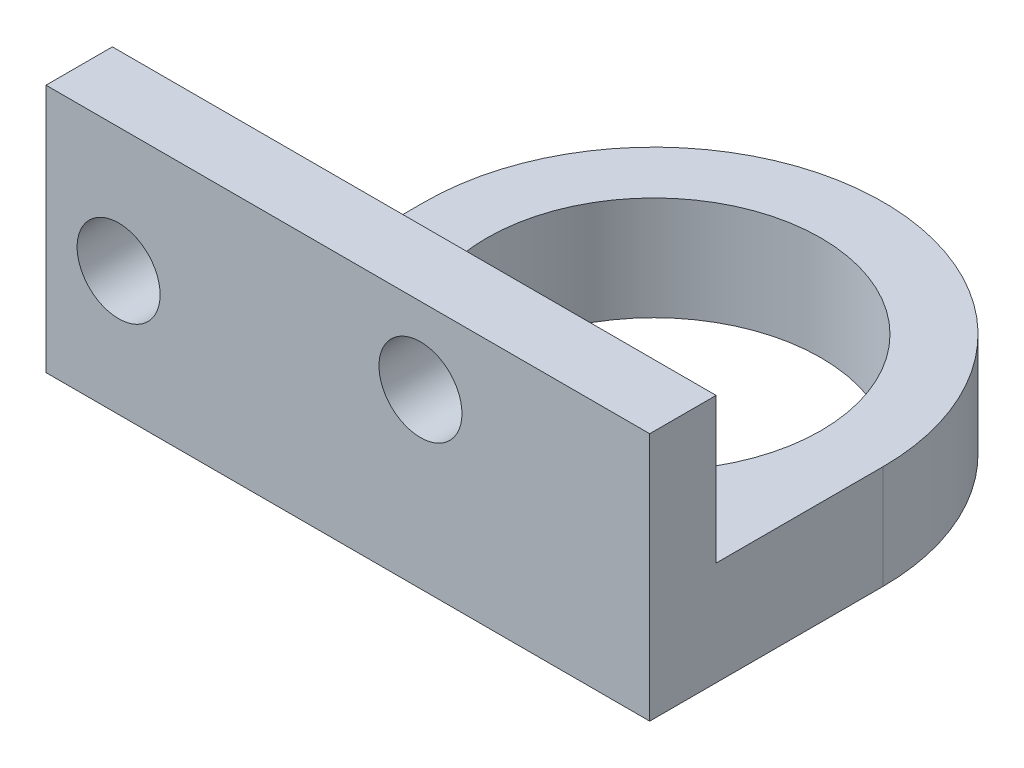
ISO-10303-21;
HEADER;
FILE_DESCRIPTION(('STEP AP214'),'2;1');
FILE_NAME('part.step','',(''),(''),'','','');
FILE_SCHEMA(('AUTOMOTIVE_DESIGN { 1 0 10303 214 1 1 1 1 }'));
ENDSEC;
DATA;
#1=APPLICATION_CONTEXT('core data for automotive mechanical design processes');
#2=APPLICATION_PROTOCOL_DEFINITION('international standard','automotive_design',2000,#1);
#3=PRODUCT_CONTEXT('',#1,'mechanical');
#4=PRODUCT('Part','Part','',(#3));
#5=PRODUCT_RELATED_PRODUCT_CATEGORY('part','',(#4));
#6=PRODUCT_DEFINITION_FORMATION('','',#4);
#7=PRODUCT_DEFINITION_CONTEXT('part definition',#1,'design');
#8=PRODUCT_DEFINITION('design','',#6,#7);
#9=PRODUCT_DEFINITION_SHAPE('','',#8);
#10=(LENGTH_UNIT() NAMED_UNIT(*) SI_UNIT(.MILLI.,.METRE.));
#11=(NAMED_UNIT(*) PLANE_ANGLE_UNIT() SI_UNIT($,.RADIAN.));
#12=(NAMED_UNIT(*) SI_UNIT($,.STERADIAN.) SOLID_ANGLE_UNIT());
#13=UNCERTAINTY_MEASURE_WITH_UNIT(LENGTH_MEASURE(1.E-05),#10,'distance_accuracy_value','');
#14=(GEOMETRIC_REPRESENTATION_CONTEXT(3) GLOBAL_UNCERTAINTY_ASSIGNED_CONTEXT((#13)) GLOBAL_UNIT_ASSIGNED_CONTEXT((#10,
#11,#12)) REPRESENTATION_CONTEXT('',''));
#15=CARTESIAN_POINT('',(0.,0.,0.));
#16=DIRECTION('',(0.,0.,1.));
#17=DIRECTION('',(1.,0.,0.));
#18=AXIS2_PLACEMENT_3D('',#15,#16,#17);
#19=CARTESIAN_POINT('',(0.,5.,0.));
#20=DIRECTION('',(0.,1.,0.));
#21=DIRECTION('',(0.,0.,1.));
#22=AXIS2_PLACEMENT_3D('',#19,#20,#21);
#23=PLANE('',#22);
#24=DIRECTION('',(0.,0.,1.));
#25=VECTOR('',#24,1.);
#26=CARTESIAN_POINT('',(-11.05,5.,0.));
#27=LINE('',#26,#25);
#28=CARTESIAN_POINT('',(-11.05,5.,0.));
#29=VERTEX_POINT('',#28);
#30=CARTESIAN_POINT('',(-11.05,5.,8.05));
#31=VERTEX_POINT('',#30);
#32=EDGE_CURVE('E173',#29,#31,#27,.T.);
#33=ORIENTED_EDGE('',*,*,#32,.T.);
#34=DIRECTION('',(-1.,0.,0.));
#35=VECTOR('',#34,1.);
#36=CARTESIAN_POINT('',(0.,5.,8.05));
#37=LINE('',#36,#35);
#38=CARTESIAN_POINT('',(0.,5.,8.05));
#39=VERTEX_POINT('',#38);
#40=EDGE_CURVE('E150',#39,#31,#37,.T.);
#41=ORIENTED_EDGE('',*,*,#40,.F.);
#42=CARTESIAN_POINT('',(0.,5.,0.));
#43=DIRECTION('',(0.,1.,0.));
#44=DIRECTION('',(0.,0.,1.));
#45=AXIS2_PLACEMENT_3D('',#42,#43,#44);
#46=CIRCLE('',#45,8.05);
#47=EDGE_CURVE('E166',#39,#39,#46,.T.);
#48=ORIENTED_EDGE('',*,*,#47,.F.);
#49=CARTESIAN_POINT('',(11.05,5.,8.05));
#50=VERTEX_POINT('',#49);
#51=EDGE_CURVE('E151',#50,#39,#37,.T.);
#52=ORIENTED_EDGE('',*,*,#51,.F.);
#53=DIRECTION('',(0.,0.,-1.));
#54=VECTOR('',#53,1.);
#55=CARTESIAN_POINT('',(11.05,5.,0.));
#56=LINE('',#55,#54);
#57=CARTESIAN_POINT('',(11.05,5.,0.));
#58=VERTEX_POINT('',#57);
#59=EDGE_CURVE('E175',#50,#58,#56,.T.);
#60=ORIENTED_EDGE('',*,*,#59,.T.);
#61=CARTESIAN_POINT('',(0.,5.,0.));
#62=DIRECTION('',(0.,1.,0.));
#63=DIRECTION('',(0.,0.,1.));
#64=AXIS2_PLACEMENT_3D('',#61,#62,#63);
#65=CIRCLE('',#64,11.05);
#66=EDGE_CURVE('E114',#58,#29,#65,.T.);
#67=ORIENTED_EDGE('',*,*,#66,.T.);
#68=EDGE_LOOP('',(#33,#41,#48,#52,#60,#67));
#69=FACE_BOUND('',#68,.T.);
#70=ADVANCED_FACE('F43',(#69),#23,.T.);
#71=CARTESIAN_POINT('',(-11.05,5.,0.));
#72=DIRECTION('',(1.,0.,0.));
#73=DIRECTION('',(0.,0.,-1.));
#74=AXIS2_PLACEMENT_3D('',#71,#72,#73);
#75=PLANE('',#74);
#76=DIRECTION('',(0.,-1.,0.));
#77=VECTOR('',#76,1.);
#78=CARTESIAN_POINT('',(-11.05,0.,8.05));
#79=LINE('',#78,#77);
#80=CARTESIAN_POINT('',(-11.05,0.,8.05));
#81=VERTEX_POINT('',#80);
#82=EDGE_CURVE('E58',#31,#81,#79,.T.);
#83=ORIENTED_EDGE('',*,*,#82,.F.);
#84=ORIENTED_EDGE('',*,*,#32,.F.);
#85=DIRECTION('',(0.,-1.,0.));
#86=VECTOR('',#85,1.);
#87=CARTESIAN_POINT('',(-11.05,5.,0.));
#88=LINE('',#87,#86);
#89=CARTESIAN_POINT('',(-11.05,0.,0.));
#90=VERTEX_POINT('',#89);
#91=EDGE_CURVE('E11',#29,#90,#88,.T.);
#92=ORIENTED_EDGE('',*,*,#91,.T.);
#93=DIRECTION('',(0.,0.,1.));
#94=VECTOR('',#93,1.);
#95=CARTESIAN_POINT('',(-11.05,0.,0.));
#96=LINE('',#95,#94);
#97=EDGE_CURVE('E62',#90,#81,#96,.T.);
#98=ORIENTED_EDGE('',*,*,#97,.T.);
#99=EDGE_LOOP('',(#83,#84,#92,#98));
#100=FACE_BOUND('',#99,.T.);
#101=ADVANCED_FACE('F204',(#100),#75,.F.);
#102=CARTESIAN_POINT('',(0.,0.,0.));
#103=DIRECTION('',(0.,1.,0.));
#104=DIRECTION('',(0.,0.,1.));
#105=AXIS2_PLACEMENT_3D('',#102,#103,#104);
#106=PLANE('',#105);
#107=CARTESIAN_POINT('',(0.,0.,0.));
#108=DIRECTION('',(0.,1.,0.));
#109=DIRECTION('',(0.,0.,1.));
#110=AXIS2_PLACEMENT_3D('',#107,#108,#109);
#111=CIRCLE('',#110,11.05);
#112=CARTESIAN_POINT('',(11.05,0.,0.));
#113=VERTEX_POINT('',#112);
#114=EDGE_CURVE('E110',#113,#90,#111,.T.);
#115=ORIENTED_EDGE('',*,*,#114,.F.);
#116=DIRECTION('',(0.,0.,-1.));
#117=VECTOR('',#116,1.);
#118=CARTESIAN_POINT('',(11.05,0.,0.));
#119=LINE('',#118,#117);
#120=CARTESIAN_POINT('',(11.05,0.,11.25));
#121=VERTEX_POINT('',#120);
#122=EDGE_CURVE('E102',#121,#113,#119,.T.);
#123=ORIENTED_EDGE('',*,*,#122,.F.);
#124=DIRECTION('',(1.,0.,0.));
#125=VECTOR('',#124,1.);
#126=CARTESIAN_POINT('',(-18.05,0.,11.25));
#127=LINE('',#126,#125);
#128=CARTESIAN_POINT('',(-18.05,0.,11.25));
#129=VERTEX_POINT('',#128);
#130=EDGE_CURVE('E108',#129,#121,#127,.T.);
#131=ORIENTED_EDGE('',*,*,#130,.F.);
#132=DIRECTION('',(0.,0.,1.));
#133=VECTOR('',#132,1.);
#134=CARTESIAN_POINT('',(-18.05,0.,8.05));
#135=LINE('',#134,#133);
#136=CARTESIAN_POINT('',(-18.05,0.,8.05));
#137=VERTEX_POINT('',#136);
#138=EDGE_CURVE('E160',#137,#129,#135,.T.);
#139=ORIENTED_EDGE('',*,*,#138,.F.);
#140=DIRECTION('',(-1.,0.,0.));
#141=VECTOR('',#140,1.);
#142=CARTESIAN_POINT('',(0.,0.,8.05));
#143=LINE('',#142,#141);
#144=EDGE_CURVE('E147',#81,#137,#143,.T.);
#145=ORIENTED_EDGE('',*,*,#144,.F.);
#146=ORIENTED_EDGE('',*,*,#97,.F.);
#147=EDGE_LOOP('',(#115,#123,#131,#139,#145,#146));
#148=FACE_BOUND('',#147,.T.);
#149=CARTESIAN_POINT('',(0.,0.,0.));
#150=DIRECTION('',(0.,1.,0.));
#151=DIRECTION('',(0.,0.,1.));
#152=AXIS2_PLACEMENT_3D('',#149,#150,#151);
#153=CIRCLE('',#152,8.05);
#154=CARTESIAN_POINT('',(0.,0.,8.05));
#155=VERTEX_POINT('',#154);
#156=EDGE_CURVE('E162',#155,#155,#153,.T.);
#157=ORIENTED_EDGE('',*,*,#156,.T.);
#158=EDGE_LOOP('',(#157));
#159=FACE_BOUND('',#158,.T.);
#160=ADVANCED_FACE('F104',(#148,#159),#106,.F.);
#161=CARTESIAN_POINT('',(0.,5.,0.));
#162=DIRECTION('',(0.,-1.,0.));
#163=DIRECTION('',(0.,0.,-1.));
#164=AXIS2_PLACEMENT_3D('',#161,#162,#163);
#165=CYLINDRICAL_SURFACE('',#164,11.05);
#166=ORIENTED_EDGE('',*,*,#114,.T.);
#167=ORIENTED_EDGE('',*,*,#91,.F.);
#168=ORIENTED_EDGE('',*,*,#66,.F.);
#169=DIRECTION('',(0.,-1.,0.));
#170=VECTOR('',#169,1.);
#171=CARTESIAN_POINT('',(11.05,5.,0.));
#172=LINE('',#171,#170);
#173=EDGE_CURVE('E51',#58,#113,#172,.T.);
#174=ORIENTED_EDGE('',*,*,#173,.T.);
#175=EDGE_LOOP('',(#166,#167,#168,#174));
#176=FACE_BOUND('',#175,.T.);
#177=ADVANCED_FACE('F45',(#176),#165,.T.);
#178=CARTESIAN_POINT('',(11.05,5.,0.));
#179=DIRECTION('',(-1.,0.,0.));
#180=DIRECTION('',(0.,0.,1.));
#181=AXIS2_PLACEMENT_3D('',#178,#179,#180);
#182=PLANE('',#181);
#183=ORIENTED_EDGE('',*,*,#122,.T.);
#184=ORIENTED_EDGE('',*,*,#173,.F.);
#185=ORIENTED_EDGE('',*,*,#59,.F.);
#186=DIRECTION('',(0.,1.,0.));
#187=VECTOR('',#186,1.);
#188=CARTESIAN_POINT('',(11.05,0.,8.05));
#189=LINE('',#188,#187);
#190=CARTESIAN_POINT('',(11.05,12.,8.05));
#191=VERTEX_POINT('',#190);
#192=EDGE_CURVE('E140',#50,#191,#189,.T.);
#193=ORIENTED_EDGE('',*,*,#192,.T.);
#194=DIRECTION('',(0.,0.,1.));
#195=VECTOR('',#194,1.);
#196=CARTESIAN_POINT('',(11.05,12.,8.05));
#197=LINE('',#196,#195);
#198=CARTESIAN_POINT('',(11.05,12.,11.25));
#199=VERTEX_POINT('',#198);
#200=EDGE_CURVE('E120',#191,#199,#197,.T.);
#201=ORIENTED_EDGE('',*,*,#200,.T.);
#202=DIRECTION('',(0.,1.,0.));
#203=VECTOR('',#202,1.);
#204=CARTESIAN_POINT('',(11.05,0.,11.25));
#205=LINE('',#204,#203);
#206=EDGE_CURVE('E117',#121,#199,#205,.T.);
#207=ORIENTED_EDGE('',*,*,#206,.F.);
#208=EDGE_LOOP('',(#183,#184,#185,#193,#201,#207));
#209=FACE_BOUND('',#208,.T.);
#210=ADVANCED_FACE('F118',(#209),#182,.F.);
#211=CARTESIAN_POINT('',(0.,5.,0.));
#212=DIRECTION('',(0.,-1.,0.));
#213=DIRECTION('',(0.,0.,-1.));
#214=AXIS2_PLACEMENT_3D('',#211,#212,#213);
#215=CYLINDRICAL_SURFACE('',#214,8.05);
#216=ORIENTED_EDGE('',*,*,#47,.T.);
#217=EDGE_LOOP('',(#216));
#218=FACE_BOUND('',#217,.T.);
#219=ORIENTED_EDGE('',*,*,#156,.F.);
#220=EDGE_LOOP('',(#219));
#221=FACE_BOUND('',#220,.T.);
#222=ADVANCED_FACE('F198',(#218,#221),#215,.F.);
#223=CARTESIAN_POINT('',(-18.05,0.,8.05));
#224=DIRECTION('',(1.,0.,0.));
#225=DIRECTION('',(0.,0.,-1.));
#226=AXIS2_PLACEMENT_3D('',#223,#224,#225);
#227=PLANE('',#226);
#228=ORIENTED_EDGE('',*,*,#138,.T.);
#229=DIRECTION('',(0.,-1.,0.));
#230=VECTOR('',#229,1.);
#231=CARTESIAN_POINT('',(-18.05,12.,11.25));
#232=LINE('',#231,#230);
#233=CARTESIAN_POINT('',(-18.05,12.,11.25));
#234=VERTEX_POINT('',#233);
#235=EDGE_CURVE('E130',#234,#129,#232,.T.);
#236=ORIENTED_EDGE('',*,*,#235,.F.);
#237=DIRECTION('',(0.,0.,1.));
#238=VECTOR('',#237,1.);
#239=CARTESIAN_POINT('',(-18.05,12.,8.05));
#240=LINE('',#239,#238);
#241=CARTESIAN_POINT('',(-18.05,12.,8.05));
#242=VERTEX_POINT('',#241);
#243=EDGE_CURVE('E163',#242,#234,#240,.T.);
#244=ORIENTED_EDGE('',*,*,#243,.F.);
#245=DIRECTION('',(0.,1.,0.));
#246=VECTOR('',#245,1.);
#247=CARTESIAN_POINT('',(-18.05,0.,8.05));
#248=LINE('',#247,#246);
#249=EDGE_CURVE('E145',#137,#242,#248,.T.);
#250=ORIENTED_EDGE('',*,*,#249,.F.);
#251=EDGE_LOOP('',(#228,#236,#244,#250));
#252=FACE_BOUND('',#251,.T.);
#253=ADVANCED_FACE('F195',(#252),#227,.F.);
#254=CARTESIAN_POINT('',(0.,8.31387964148535,8.05));
#255=DIRECTION('',(0.,0.,1.));
#256=DIRECTION('',(1.,0.,0.));
#257=AXIS2_PLACEMENT_3D('',#254,#255,#256);
#258=CYLINDRICAL_SURFACE('',#257,2.);
#259=CARTESIAN_POINT('',(0.,8.31387964148535,8.05));
#260=DIRECTION('',(0.,0.,1.));
#261=DIRECTION('',(1.,0.,0.));
#262=AXIS2_PLACEMENT_3D('',#259,#260,#261);
#263=CIRCLE('',#262,2.);
#264=CARTESIAN_POINT('',(2.,8.31387964148535,8.05));
#265=VERTEX_POINT('',#264);
#266=EDGE_CURVE('E154',#265,#265,#263,.T.);
#267=ORIENTED_EDGE('',*,*,#266,.F.);
#268=EDGE_LOOP('',(#267));
#269=FACE_BOUND('',#268,.T.);
#270=CARTESIAN_POINT('',(0.,8.31387964148535,11.25));
#271=DIRECTION('',(0.,0.,1.));
#272=DIRECTION('',(1.,0.,0.));
#273=AXIS2_PLACEMENT_3D('',#270,#271,#272);
#274=CIRCLE('',#273,2.);
#275=CARTESIAN_POINT('',(2.,8.31387964148535,11.25));
#276=VERTEX_POINT('',#275);
#277=EDGE_CURVE('E131',#276,#276,#274,.T.);
#278=ORIENTED_EDGE('',*,*,#277,.T.);
#279=EDGE_LOOP('',(#278));
#280=FACE_BOUND('',#279,.T.);
#281=ADVANCED_FACE('F219',(#269,#280),#258,.F.);
#282=CARTESIAN_POINT('',(0.,12.,8.05));
#283=DIRECTION('',(0.,1.,0.));
#284=DIRECTION('',(-1.,0.,0.));
#285=AXIS2_PLACEMENT_3D('',#282,#283,#284);
#286=PLANE('',#285);
#287=ORIENTED_EDGE('',*,*,#243,.T.);
#288=DIRECTION('',(-1.,0.,0.));
#289=VECTOR('',#288,1.);
#290=CARTESIAN_POINT('',(11.05,12.,11.25));
#291=LINE('',#290,#289);
#292=EDGE_CURVE('E124',#199,#234,#291,.T.);
#293=ORIENTED_EDGE('',*,*,#292,.F.);
#294=ORIENTED_EDGE('',*,*,#200,.F.);
#295=DIRECTION('',(-1.,0.,0.));
#296=VECTOR('',#295,1.);
#297=CARTESIAN_POINT('',(0.,12.,8.05));
#298=LINE('',#297,#296);
#299=EDGE_CURVE('E142',#191,#242,#298,.T.);
#300=ORIENTED_EDGE('',*,*,#299,.T.);
#301=EDGE_LOOP('',(#287,#293,#294,#300));
#302=FACE_BOUND('',#301,.T.);
#303=ADVANCED_FACE('F193',(#302),#286,.T.);
#304=CARTESIAN_POINT('',(-14.55,6.,8.05));
#305=DIRECTION('',(0.,0.,1.));
#306=DIRECTION('',(1.,0.,0.));
#307=AXIS2_PLACEMENT_3D('',#304,#305,#306);
#308=CYLINDRICAL_SURFACE('',#307,2.);
#309=CARTESIAN_POINT('',(-14.55,6.,8.05));
#310=DIRECTION('',(0.,0.,1.));
#311=DIRECTION('',(1.,0.,0.));
#312=AXIS2_PLACEMENT_3D('',#309,#310,#311);
#313=CIRCLE('',#312,2.);
#314=CARTESIAN_POINT('',(-12.55,6.,8.05));
#315=VERTEX_POINT('',#314);
#316=EDGE_CURVE('E157',#315,#315,#313,.T.);
#317=ORIENTED_EDGE('',*,*,#316,.F.);
#318=EDGE_LOOP('',(#317));
#319=FACE_BOUND('',#318,.T.);
#320=CARTESIAN_POINT('',(-14.55,6.,11.25));
#321=DIRECTION('',(0.,0.,1.));
#322=DIRECTION('',(1.,0.,0.));
#323=AXIS2_PLACEMENT_3D('',#320,#321,#322);
#324=CIRCLE('',#323,2.);
#325=CARTESIAN_POINT('',(-12.55,6.,11.25));
#326=VERTEX_POINT('',#325);
#327=EDGE_CURVE('E134',#326,#326,#324,.T.);
#328=ORIENTED_EDGE('',*,*,#327,.T.);
#329=EDGE_LOOP('',(#328));
#330=FACE_BOUND('',#329,.T.);
#331=ADVANCED_FACE('F218',(#319,#330),#308,.F.);
#332=CARTESIAN_POINT('',(0.,0.,8.05));
#333=DIRECTION('',(0.,0.,1.));
#334=DIRECTION('',(1.,0.,0.));
#335=AXIS2_PLACEMENT_3D('',#332,#333,#334);
#336=PLANE('',#335);
#337=ORIENTED_EDGE('',*,*,#192,.F.);
#338=ORIENTED_EDGE('',*,*,#51,.T.);
#339=ORIENTED_EDGE('',*,*,#40,.T.);
#340=ORIENTED_EDGE('',*,*,#82,.T.);
#341=ORIENTED_EDGE('',*,*,#144,.T.);
#342=ORIENTED_EDGE('',*,*,#249,.T.);
#343=ORIENTED_EDGE('',*,*,#299,.F.);
#344=EDGE_LOOP('',(#337,#338,#339,#340,#341,#342,#343));
#345=FACE_BOUND('',#344,.T.);
#346=ORIENTED_EDGE('',*,*,#266,.T.);
#347=EDGE_LOOP('',(#346));
#348=FACE_BOUND('',#347,.T.);
#349=ORIENTED_EDGE('',*,*,#316,.T.);
#350=EDGE_LOOP('',(#349));
#351=FACE_BOUND('',#350,.T.);
#352=ADVANCED_FACE('F188',(#345,#348,#351),#336,.F.);
#353=CARTESIAN_POINT('',(0.,0.,11.25));
#354=DIRECTION('',(0.,0.,1.));
#355=DIRECTION('',(1.,0.,0.));
#356=AXIS2_PLACEMENT_3D('',#353,#354,#355);
#357=PLANE('',#356);
#358=ORIENTED_EDGE('',*,*,#277,.F.);
#359=EDGE_LOOP('',(#358));
#360=FACE_BOUND('',#359,.T.);
#361=ORIENTED_EDGE('',*,*,#130,.T.);
#362=ORIENTED_EDGE('',*,*,#206,.T.);
#363=ORIENTED_EDGE('',*,*,#292,.T.);
#364=ORIENTED_EDGE('',*,*,#235,.T.);
#365=EDGE_LOOP('',(#361,#362,#363,#364));
#366=FACE_BOUND('',#365,.T.);
#367=ORIENTED_EDGE('',*,*,#327,.F.);
#368=EDGE_LOOP('',(#367));
#369=FACE_BOUND('',#368,.T.);
#370=ADVANCED_FACE('F127',(#360,#366,#369),#357,.T.);
#371=CLOSED_SHELL('',(#70,#101,#160,#177,#210,#222,#253,#281,#303,#331,#352,#370));
#372=MANIFOLD_SOLID_BREP('B2',#371);
#373=ADVANCED_BREP_SHAPE_REPRESENTATION('',(#18,#372),#14);
#374=SHAPE_DEFINITION_REPRESENTATION(#9,#373);
ENDSEC;
END-ISO-10303-21;
